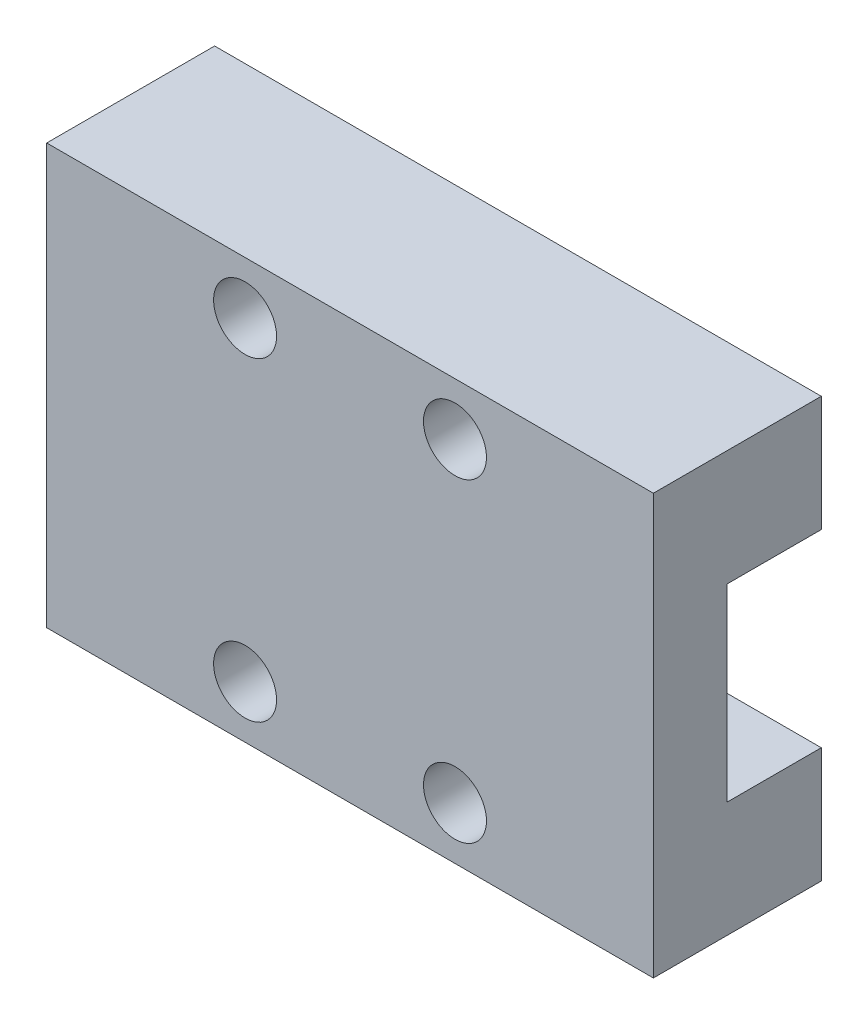
ISO-10303-21;
HEADER;
FILE_DESCRIPTION(('STEP AP214'),'2;1');
FILE_NAME('part.step','',(''),(''),'','','');
FILE_SCHEMA(('AUTOMOTIVE_DESIGN { 1 0 10303 214 1 1 1 1 }'));
ENDSEC;
DATA;
#1=APPLICATION_CONTEXT('core data for automotive mechanical design processes');
#2=APPLICATION_PROTOCOL_DEFINITION('international standard','automotive_design',2000,#1);
#3=PRODUCT_CONTEXT('',#1,'mechanical');
#4=PRODUCT('Part','Part','',(#3));
#5=PRODUCT_RELATED_PRODUCT_CATEGORY('part','',(#4));
#6=PRODUCT_DEFINITION_FORMATION('','',#4);
#7=PRODUCT_DEFINITION_CONTEXT('part definition',#1,'design');
#8=PRODUCT_DEFINITION('design','',#6,#7);
#9=PRODUCT_DEFINITION_SHAPE('','',#8);
#10=(LENGTH_UNIT() NAMED_UNIT(*) SI_UNIT(.MILLI.,.METRE.));
#11=(NAMED_UNIT(*) PLANE_ANGLE_UNIT() SI_UNIT($,.RADIAN.));
#12=(NAMED_UNIT(*) SI_UNIT($,.STERADIAN.) SOLID_ANGLE_UNIT());
#13=UNCERTAINTY_MEASURE_WITH_UNIT(LENGTH_MEASURE(1.E-05),#10,'distance_accuracy_value','');
#14=(GEOMETRIC_REPRESENTATION_CONTEXT(3) GLOBAL_UNCERTAINTY_ASSIGNED_CONTEXT((#13)) GLOBAL_UNIT_ASSIGNED_CONTEXT((#10,
#11,#12)) REPRESENTATION_CONTEXT('',''));
#15=CARTESIAN_POINT('',(0.,0.,0.));
#16=DIRECTION('',(0.,0.,1.));
#17=DIRECTION('',(1.,0.,0.));
#18=AXIS2_PLACEMENT_3D('',#15,#16,#17);
#19=CARTESIAN_POINT('',(0.,0.,0.));
#20=DIRECTION('',(0.,0.,1.));
#21=DIRECTION('',(1.,0.,0.));
#22=AXIS2_PLACEMENT_3D('',#19,#20,#21);
#23=PLANE('',#22);
#24=DIRECTION('',(0.,1.,0.));
#25=VECTOR('',#24,1.);
#26=CARTESIAN_POINT('',(14.45,-10.,0.));
#27=LINE('',#26,#25);
#28=CARTESIAN_POINT('',(14.45,4.5,0.));
#29=VERTEX_POINT('',#28);
#30=CARTESIAN_POINT('',(14.45,10.,0.));
#31=VERTEX_POINT('',#30);
#32=EDGE_CURVE('E177',#29,#31,#27,.T.);
#33=ORIENTED_EDGE('',*,*,#32,.F.);
#34=DIRECTION('',(1.,0.,0.));
#35=VECTOR('',#34,1.);
#36=CARTESIAN_POINT('',(-14.45,4.5,0.));
#37=LINE('',#36,#35);
#38=CARTESIAN_POINT('',(-14.45,4.5,0.));
#39=VERTEX_POINT('',#38);
#40=EDGE_CURVE('E142',#39,#29,#37,.T.);
#41=ORIENTED_EDGE('',*,*,#40,.F.);
#42=DIRECTION('',(0.,-1.,0.));
#43=VECTOR('',#42,1.);
#44=CARTESIAN_POINT('',(-14.45,-10.,0.));
#45=LINE('',#44,#43);
#46=CARTESIAN_POINT('',(-14.45,10.,0.));
#47=VERTEX_POINT('',#46);
#48=EDGE_CURVE('E169',#47,#39,#45,.T.);
#49=ORIENTED_EDGE('',*,*,#48,.F.);
#50=DIRECTION('',(-1.,0.,0.));
#51=VECTOR('',#50,1.);
#52=CARTESIAN_POINT('',(14.45,10.,0.));
#53=LINE('',#52,#51);
#54=EDGE_CURVE('E96',#31,#47,#53,.T.);
#55=ORIENTED_EDGE('',*,*,#54,.F.);
#56=EDGE_LOOP('',(#33,#41,#49,#55));
#57=FACE_BOUND('',#56,.T.);
#58=ADVANCED_FACE('F50',(#57),#23,.F.);
#59=CARTESIAN_POINT('',(-14.45,-10.,8.));
#60=DIRECTION('',(1.,0.,0.));
#61=DIRECTION('',(0.,0.,-1.));
#62=AXIS2_PLACEMENT_3D('',#59,#60,#61);
#63=PLANE('',#62);
#64=ORIENTED_EDGE('',*,*,#48,.T.);
#65=DIRECTION('',(0.,0.,-1.));
#66=VECTOR('',#65,1.);
#67=CARTESIAN_POINT('',(-14.45,4.5,4.5));
#68=LINE('',#67,#66);
#69=CARTESIAN_POINT('',(-14.45,4.5,4.5));
#70=VERTEX_POINT('',#69);
#71=EDGE_CURVE('E153',#70,#39,#68,.T.);
#72=ORIENTED_EDGE('',*,*,#71,.F.);
#73=DIRECTION('',(0.,1.,0.));
#74=VECTOR('',#73,1.);
#75=CARTESIAN_POINT('',(-14.45,-4.5,4.5));
#76=LINE('',#75,#74);
#77=CARTESIAN_POINT('',(-14.45,-4.5,4.5));
#78=VERTEX_POINT('',#77);
#79=EDGE_CURVE('E131',#78,#70,#76,.T.);
#80=ORIENTED_EDGE('',*,*,#79,.F.);
#81=DIRECTION('',(0.,0.,-1.));
#82=VECTOR('',#81,1.);
#83=CARTESIAN_POINT('',(-14.45,-4.5,4.5));
#84=LINE('',#83,#82);
#85=CARTESIAN_POINT('',(-14.45,-4.5,0.));
#86=VERTEX_POINT('',#85);
#87=EDGE_CURVE('E127',#78,#86,#84,.T.);
#88=ORIENTED_EDGE('',*,*,#87,.T.);
#89=CARTESIAN_POINT('',(-14.45,-10.,0.));
#90=VERTEX_POINT('',#89);
#91=EDGE_CURVE('E174',#86,#90,#45,.T.);
#92=ORIENTED_EDGE('',*,*,#91,.T.);
#93=DIRECTION('',(0.,0.,-1.));
#94=VECTOR('',#93,1.);
#95=CARTESIAN_POINT('',(-14.45,-10.,8.));
#96=LINE('',#95,#94);
#97=CARTESIAN_POINT('',(-14.45,-10.,8.));
#98=VERTEX_POINT('',#97);
#99=EDGE_CURVE('E11',#98,#90,#96,.T.);
#100=ORIENTED_EDGE('',*,*,#99,.F.);
#101=DIRECTION('',(0.,-1.,0.));
#102=VECTOR('',#101,1.);
#103=CARTESIAN_POINT('',(-14.45,-10.,8.));
#104=LINE('',#103,#102);
#105=CARTESIAN_POINT('',(-14.45,10.,8.));
#106=VERTEX_POINT('',#105);
#107=EDGE_CURVE('E158',#106,#98,#104,.T.);
#108=ORIENTED_EDGE('',*,*,#107,.F.);
#109=DIRECTION('',(0.,0.,-1.));
#110=VECTOR('',#109,1.);
#111=CARTESIAN_POINT('',(-14.45,10.,8.));
#112=LINE('',#111,#110);
#113=EDGE_CURVE('E168',#106,#47,#112,.T.);
#114=ORIENTED_EDGE('',*,*,#113,.T.);
#115=EDGE_LOOP('',(#64,#72,#80,#88,#92,#100,#108,#114));
#116=FACE_BOUND('',#115,.T.);
#117=ADVANCED_FACE('F52',(#116),#63,.F.);
#118=CARTESIAN_POINT('',(14.45,-10.,8.));
#119=DIRECTION('',(0.,1.,0.));
#120=DIRECTION('',(-1.,0.,0.));
#121=AXIS2_PLACEMENT_3D('',#118,#119,#120);
#122=PLANE('',#121);
#123=DIRECTION('',(1.,0.,0.));
#124=VECTOR('',#123,1.);
#125=CARTESIAN_POINT('',(14.45,-10.,0.));
#126=LINE('',#125,#124);
#127=CARTESIAN_POINT('',(14.45,-10.,0.));
#128=VERTEX_POINT('',#127);
#129=EDGE_CURVE('E173',#90,#128,#126,.T.);
#130=ORIENTED_EDGE('',*,*,#129,.T.);
#131=DIRECTION('',(0.,0.,-1.));
#132=VECTOR('',#131,1.);
#133=CARTESIAN_POINT('',(14.45,-10.,8.));
#134=LINE('',#133,#132);
#135=CARTESIAN_POINT('',(14.45,-10.,8.));
#136=VERTEX_POINT('',#135);
#137=EDGE_CURVE('E59',#136,#128,#134,.T.);
#138=ORIENTED_EDGE('',*,*,#137,.F.);
#139=DIRECTION('',(1.,0.,0.));
#140=VECTOR('',#139,1.);
#141=CARTESIAN_POINT('',(14.45,-10.,8.));
#142=LINE('',#141,#140);
#143=EDGE_CURVE('E103',#98,#136,#142,.T.);
#144=ORIENTED_EDGE('',*,*,#143,.F.);
#145=ORIENTED_EDGE('',*,*,#99,.T.);
#146=EDGE_LOOP('',(#130,#138,#144,#145));
#147=FACE_BOUND('',#146,.T.);
#148=ADVANCED_FACE('F280',(#147),#122,.F.);
#149=CARTESIAN_POINT('',(14.45,-10.,8.));
#150=DIRECTION('',(-1.,0.,0.));
#151=DIRECTION('',(0.,-1.,0.));
#152=AXIS2_PLACEMENT_3D('',#149,#150,#151);
#153=PLANE('',#152);
#154=DIRECTION('',(0.,-1.,0.));
#155=VECTOR('',#154,1.);
#156=CARTESIAN_POINT('',(14.45,-4.5,4.5));
#157=LINE('',#156,#155);
#158=CARTESIAN_POINT('',(14.45,4.5,4.5));
#159=VERTEX_POINT('',#158);
#160=CARTESIAN_POINT('',(14.45,-4.5,4.5));
#161=VERTEX_POINT('',#160);
#162=EDGE_CURVE('E132',#159,#161,#157,.T.);
#163=ORIENTED_EDGE('',*,*,#162,.F.);
#164=DIRECTION('',(0.,0.,-1.));
#165=VECTOR('',#164,1.);
#166=CARTESIAN_POINT('',(14.45,4.5,4.5));
#167=LINE('',#166,#165);
#168=EDGE_CURVE('E205',#159,#29,#167,.T.);
#169=ORIENTED_EDGE('',*,*,#168,.T.);
#170=ORIENTED_EDGE('',*,*,#32,.T.);
#171=DIRECTION('',(0.,0.,-1.));
#172=VECTOR('',#171,1.);
#173=CARTESIAN_POINT('',(14.45,10.,8.));
#174=LINE('',#173,#172);
#175=CARTESIAN_POINT('',(14.45,10.,8.));
#176=VERTEX_POINT('',#175);
#177=EDGE_CURVE('E184',#176,#31,#174,.T.);
#178=ORIENTED_EDGE('',*,*,#177,.F.);
#179=DIRECTION('',(0.,1.,0.));
#180=VECTOR('',#179,1.);
#181=CARTESIAN_POINT('',(14.45,-10.,8.));
#182=LINE('',#181,#180);
#183=EDGE_CURVE('E163',#136,#176,#182,.T.);
#184=ORIENTED_EDGE('',*,*,#183,.F.);
#185=ORIENTED_EDGE('',*,*,#137,.T.);
#186=CARTESIAN_POINT('',(14.45,-4.5,0.));
#187=VERTEX_POINT('',#186);
#188=EDGE_CURVE('E148',#128,#187,#27,.T.);
#189=ORIENTED_EDGE('',*,*,#188,.T.);
#190=DIRECTION('',(0.,0.,-1.));
#191=VECTOR('',#190,1.);
#192=CARTESIAN_POINT('',(14.45,-4.5,4.5));
#193=LINE('',#192,#191);
#194=EDGE_CURVE('E66',#161,#187,#193,.T.);
#195=ORIENTED_EDGE('',*,*,#194,.F.);
#196=EDGE_LOOP('',(#163,#169,#170,#178,#184,#185,#189,#195));
#197=FACE_BOUND('',#196,.T.);
#198=ADVANCED_FACE('F145',(#197),#153,.F.);
#199=CARTESIAN_POINT('',(14.45,10.,8.));
#200=DIRECTION('',(0.,-1.,0.));
#201=DIRECTION('',(1.,0.,0.));
#202=AXIS2_PLACEMENT_3D('',#199,#200,#201);
#203=PLANE('',#202);
#204=ORIENTED_EDGE('',*,*,#54,.T.);
#205=ORIENTED_EDGE('',*,*,#113,.F.);
#206=DIRECTION('',(-1.,0.,0.));
#207=VECTOR('',#206,1.);
#208=CARTESIAN_POINT('',(14.45,10.,8.));
#209=LINE('',#208,#207);
#210=EDGE_CURVE('E75',#176,#106,#209,.T.);
#211=ORIENTED_EDGE('',*,*,#210,.F.);
#212=ORIENTED_EDGE('',*,*,#177,.T.);
#213=EDGE_LOOP('',(#204,#205,#211,#212));
#214=FACE_BOUND('',#213,.T.);
#215=ADVANCED_FACE('F218',(#214),#203,.F.);
#216=CARTESIAN_POINT('',(0.,0.,8.));
#217=DIRECTION('',(0.,0.,1.));
#218=DIRECTION('',(1.,0.,0.));
#219=AXIS2_PLACEMENT_3D('',#216,#217,#218);
#220=PLANE('',#219);
#221=CARTESIAN_POINT('',(-5.,-7.5,8.));
#222=DIRECTION('',(0.,0.,1.));
#223=DIRECTION('',(-1.,0.,0.));
#224=AXIS2_PLACEMENT_3D('',#221,#222,#223);
#225=CIRCLE('',#224,1.5);
#226=CARTESIAN_POINT('',(-6.5,-7.5,8.));
#227=VERTEX_POINT('',#226);
#228=EDGE_CURVE('E225',#227,#227,#225,.T.);
#229=ORIENTED_EDGE('',*,*,#228,.F.);
#230=EDGE_LOOP('',(#229));
#231=FACE_BOUND('',#230,.T.);
#232=CARTESIAN_POINT('',(5.,7.5,8.));
#233=DIRECTION('',(0.,0.,1.));
#234=DIRECTION('',(-1.,0.,0.));
#235=AXIS2_PLACEMENT_3D('',#232,#233,#234);
#236=CIRCLE('',#235,1.5);
#237=CARTESIAN_POINT('',(3.5,7.5,8.));
#238=VERTEX_POINT('',#237);
#239=EDGE_CURVE('E231',#238,#238,#236,.T.);
#240=ORIENTED_EDGE('',*,*,#239,.F.);
#241=EDGE_LOOP('',(#240));
#242=FACE_BOUND('',#241,.T.);
#243=CARTESIAN_POINT('',(5.,-7.5,8.));
#244=DIRECTION('',(0.,0.,1.));
#245=DIRECTION('',(1.,0.,0.));
#246=AXIS2_PLACEMENT_3D('',#243,#244,#245);
#247=CIRCLE('',#246,1.5);
#248=CARTESIAN_POINT('',(6.5,-7.5,8.));
#249=VERTEX_POINT('',#248);
#250=EDGE_CURVE('E232',#249,#249,#247,.T.);
#251=ORIENTED_EDGE('',*,*,#250,.F.);
#252=EDGE_LOOP('',(#251));
#253=FACE_BOUND('',#252,.T.);
#254=CARTESIAN_POINT('',(-5.,7.5,8.));
#255=DIRECTION('',(0.,0.,1.));
#256=DIRECTION('',(1.,0.,0.));
#257=AXIS2_PLACEMENT_3D('',#254,#255,#256);
#258=CIRCLE('',#257,1.5);
#259=CARTESIAN_POINT('',(-3.5,7.5,8.));
#260=VERTEX_POINT('',#259);
#261=EDGE_CURVE('E201',#260,#260,#258,.T.);
#262=ORIENTED_EDGE('',*,*,#261,.F.);
#263=EDGE_LOOP('',(#262));
#264=FACE_BOUND('',#263,.T.);
#265=ORIENTED_EDGE('',*,*,#107,.T.);
#266=ORIENTED_EDGE('',*,*,#143,.T.);
#267=ORIENTED_EDGE('',*,*,#183,.T.);
#268=ORIENTED_EDGE('',*,*,#210,.T.);
#269=EDGE_LOOP('',(#265,#266,#267,#268));
#270=FACE_BOUND('',#269,.T.);
#271=ADVANCED_FACE('F253',(#231,#242,#253,#264,#270),#220,.T.);
#272=ORIENTED_EDGE('',*,*,#91,.F.);
#273=DIRECTION('',(-1.,0.,0.));
#274=VECTOR('',#273,1.);
#275=CARTESIAN_POINT('',(-14.45,-4.5,0.));
#276=LINE('',#275,#274);
#277=EDGE_CURVE('E193',#187,#86,#276,.T.);
#278=ORIENTED_EDGE('',*,*,#277,.F.);
#279=ORIENTED_EDGE('',*,*,#188,.F.);
#280=ORIENTED_EDGE('',*,*,#129,.F.);
#281=EDGE_LOOP('',(#272,#278,#279,#280));
#282=FACE_BOUND('',#281,.T.);
#283=ADVANCED_FACE('F192',(#282),#23,.F.);
#284=CARTESIAN_POINT('',(-14.45,4.5,4.5));
#285=DIRECTION('',(0.,1.,0.));
#286=DIRECTION('',(0.,0.,1.));
#287=AXIS2_PLACEMENT_3D('',#284,#285,#286);
#288=PLANE('',#287);
#289=ORIENTED_EDGE('',*,*,#40,.T.);
#290=ORIENTED_EDGE('',*,*,#168,.F.);
#291=DIRECTION('',(1.,0.,0.));
#292=VECTOR('',#291,1.);
#293=CARTESIAN_POINT('',(-14.45,4.5,4.5));
#294=LINE('',#293,#292);
#295=EDGE_CURVE('E138',#70,#159,#294,.T.);
#296=ORIENTED_EDGE('',*,*,#295,.F.);
#297=ORIENTED_EDGE('',*,*,#71,.T.);
#298=EDGE_LOOP('',(#289,#290,#296,#297));
#299=FACE_BOUND('',#298,.T.);
#300=ADVANCED_FACE('F211',(#299),#288,.F.);
#301=CARTESIAN_POINT('',(-14.45,-4.5,4.5));
#302=DIRECTION('',(0.,-1.,0.));
#303=DIRECTION('',(0.,0.,-1.));
#304=AXIS2_PLACEMENT_3D('',#301,#302,#303);
#305=PLANE('',#304);
#306=ORIENTED_EDGE('',*,*,#277,.T.);
#307=ORIENTED_EDGE('',*,*,#87,.F.);
#308=DIRECTION('',(-1.,0.,0.));
#309=VECTOR('',#308,1.);
#310=CARTESIAN_POINT('',(-14.45,-4.5,4.5));
#311=LINE('',#310,#309);
#312=EDGE_CURVE('E123',#161,#78,#311,.T.);
#313=ORIENTED_EDGE('',*,*,#312,.F.);
#314=ORIENTED_EDGE('',*,*,#194,.T.);
#315=EDGE_LOOP('',(#306,#307,#313,#314));
#316=FACE_BOUND('',#315,.T.);
#317=ADVANCED_FACE('F125',(#316),#305,.F.);
#318=CARTESIAN_POINT('',(0.,0.,4.5));
#319=DIRECTION('',(0.,0.,-1.));
#320=DIRECTION('',(-1.,0.,0.));
#321=AXIS2_PLACEMENT_3D('',#318,#319,#320);
#322=PLANE('',#321);
#323=ORIENTED_EDGE('',*,*,#162,.T.);
#324=ORIENTED_EDGE('',*,*,#312,.T.);
#325=ORIENTED_EDGE('',*,*,#79,.T.);
#326=ORIENTED_EDGE('',*,*,#295,.T.);
#327=EDGE_LOOP('',(#323,#324,#325,#326));
#328=FACE_BOUND('',#327,.T.);
#329=ADVANCED_FACE('F136',(#328),#322,.T.);
#330=CARTESIAN_POINT('',(-5.,7.5,5.));
#331=DIRECTION('',(0.,0.,1.));
#332=DIRECTION('',(1.,0.,0.));
#333=AXIS2_PLACEMENT_3D('',#330,#331,#332);
#334=CYLINDRICAL_SURFACE('',#333,1.5);
#335=CARTESIAN_POINT('',(-5.,7.5,5.));
#336=DIRECTION('',(0.,0.,1.));
#337=DIRECTION('',(1.,0.,0.));
#338=AXIS2_PLACEMENT_3D('',#335,#336,#337);
#339=CIRCLE('',#338,1.5);
#340=CARTESIAN_POINT('',(-3.5,7.5,5.));
#341=VERTEX_POINT('',#340);
#342=EDGE_CURVE('E195',#341,#341,#339,.T.);
#343=ORIENTED_EDGE('',*,*,#342,.F.);
#344=EDGE_LOOP('',(#343));
#345=FACE_BOUND('',#344,.T.);
#346=ORIENTED_EDGE('',*,*,#261,.T.);
#347=EDGE_LOOP('',(#346));
#348=FACE_BOUND('',#347,.T.);
#349=ADVANCED_FACE('F260',(#345,#348),#334,.F.);
#350=CARTESIAN_POINT('',(-5.,7.5,5.));
#351=DIRECTION('',(0.,0.,1.));
#352=DIRECTION('',(1.,0.,0.));
#353=AXIS2_PLACEMENT_3D('',#350,#351,#352);
#354=PLANE('',#353);
#355=ORIENTED_EDGE('',*,*,#342,.T.);
#356=EDGE_LOOP('',(#355));
#357=FACE_BOUND('',#356,.T.);
#358=ADVANCED_FACE('F262',(#357),#354,.T.);
#359=CARTESIAN_POINT('',(5.,-7.5,5.));
#360=DIRECTION('',(0.,0.,1.));
#361=DIRECTION('',(1.,0.,0.));
#362=AXIS2_PLACEMENT_3D('',#359,#360,#361);
#363=CYLINDRICAL_SURFACE('',#362,1.5);
#364=CARTESIAN_POINT('',(5.,-7.5,5.));
#365=DIRECTION('',(0.,0.,1.));
#366=DIRECTION('',(1.,0.,0.));
#367=AXIS2_PLACEMENT_3D('',#364,#365,#366);
#368=CIRCLE('',#367,1.5);
#369=CARTESIAN_POINT('',(6.5,-7.5,5.));
#370=VERTEX_POINT('',#369);
#371=EDGE_CURVE('E243',#370,#370,#368,.T.);
#372=ORIENTED_EDGE('',*,*,#371,.F.);
#373=EDGE_LOOP('',(#372));
#374=FACE_BOUND('',#373,.T.);
#375=ORIENTED_EDGE('',*,*,#250,.T.);
#376=EDGE_LOOP('',(#375));
#377=FACE_BOUND('',#376,.T.);
#378=ADVANCED_FACE('F251',(#374,#377),#363,.F.);
#379=CARTESIAN_POINT('',(5.,-7.5,5.));
#380=DIRECTION('',(0.,0.,1.));
#381=DIRECTION('',(1.,0.,0.));
#382=AXIS2_PLACEMENT_3D('',#379,#380,#381);
#383=PLANE('',#382);
#384=ORIENTED_EDGE('',*,*,#371,.T.);
#385=EDGE_LOOP('',(#384));
#386=FACE_BOUND('',#385,.T.);
#387=ADVANCED_FACE('F346',(#386),#383,.T.);
#388=CARTESIAN_POINT('',(5.,7.5,5.));
#389=DIRECTION('',(0.,0.,1.));
#390=DIRECTION('',(1.,0.,0.));
#391=AXIS2_PLACEMENT_3D('',#388,#389,#390);
#392=CYLINDRICAL_SURFACE('',#391,1.5);
#393=CARTESIAN_POINT('',(5.,7.5,5.));
#394=DIRECTION('',(0.,0.,1.));
#395=DIRECTION('',(-1.,0.,0.));
#396=AXIS2_PLACEMENT_3D('',#393,#394,#395);
#397=CIRCLE('',#396,1.5);
#398=CARTESIAN_POINT('',(3.5,7.5,5.));
#399=VERTEX_POINT('',#398);
#400=EDGE_CURVE('E227',#399,#399,#397,.T.);
#401=ORIENTED_EDGE('',*,*,#400,.F.);
#402=EDGE_LOOP('',(#401));
#403=FACE_BOUND('',#402,.T.);
#404=ORIENTED_EDGE('',*,*,#239,.T.);
#405=EDGE_LOOP('',(#404));
#406=FACE_BOUND('',#405,.T.);
#407=ADVANCED_FACE('F355',(#403,#406),#392,.F.);
#408=CARTESIAN_POINT('',(5.,7.5,5.));
#409=DIRECTION('',(0.,0.,-1.));
#410=DIRECTION('',(-1.,0.,0.));
#411=AXIS2_PLACEMENT_3D('',#408,#409,#410);
#412=PLANE('',#411);
#413=ORIENTED_EDGE('',*,*,#400,.T.);
#414=EDGE_LOOP('',(#413));
#415=FACE_BOUND('',#414,.T.);
#416=ADVANCED_FACE('F364',(#415),#412,.F.);
#417=CARTESIAN_POINT('',(-5.,-7.5,5.));
#418=DIRECTION('',(0.,0.,1.));
#419=DIRECTION('',(1.,0.,0.));
#420=AXIS2_PLACEMENT_3D('',#417,#418,#419);
#421=CYLINDRICAL_SURFACE('',#420,1.5);
#422=CARTESIAN_POINT('',(-5.,-7.5,5.));
#423=DIRECTION('',(0.,0.,1.));
#424=DIRECTION('',(-1.,0.,0.));
#425=AXIS2_PLACEMENT_3D('',#422,#423,#424);
#426=CIRCLE('',#425,1.5);
#427=CARTESIAN_POINT('',(-6.5,-7.5,5.));
#428=VERTEX_POINT('',#427);
#429=EDGE_CURVE('E236',#428,#428,#426,.T.);
#430=ORIENTED_EDGE('',*,*,#429,.F.);
#431=EDGE_LOOP('',(#430));
#432=FACE_BOUND('',#431,.T.);
#433=ORIENTED_EDGE('',*,*,#228,.T.);
#434=EDGE_LOOP('',(#433));
#435=FACE_BOUND('',#434,.T.);
#436=ADVANCED_FACE('F373',(#432,#435),#421,.F.);
#437=CARTESIAN_POINT('',(-5.,-7.5,5.));
#438=DIRECTION('',(0.,0.,-1.));
#439=DIRECTION('',(-1.,0.,0.));
#440=AXIS2_PLACEMENT_3D('',#437,#438,#439);
#441=PLANE('',#440);
#442=ORIENTED_EDGE('',*,*,#429,.T.);
#443=EDGE_LOOP('',(#442));
#444=FACE_BOUND('',#443,.T.);
#445=ADVANCED_FACE('F382',(#444),#441,.F.);
#446=CLOSED_SHELL('',(#58,#117,#148,#198,#215,#271,#283,#300,#317,#329,#349,#358,#378,#387,#407,
#416,#436,#445));
#447=MANIFOLD_SOLID_BREP('B2',#446);
#448=ADVANCED_BREP_SHAPE_REPRESENTATION('',(#18,#447),#14);
#449=SHAPE_DEFINITION_REPRESENTATION(#9,#448);
ENDSEC;
END-ISO-10303-21;
